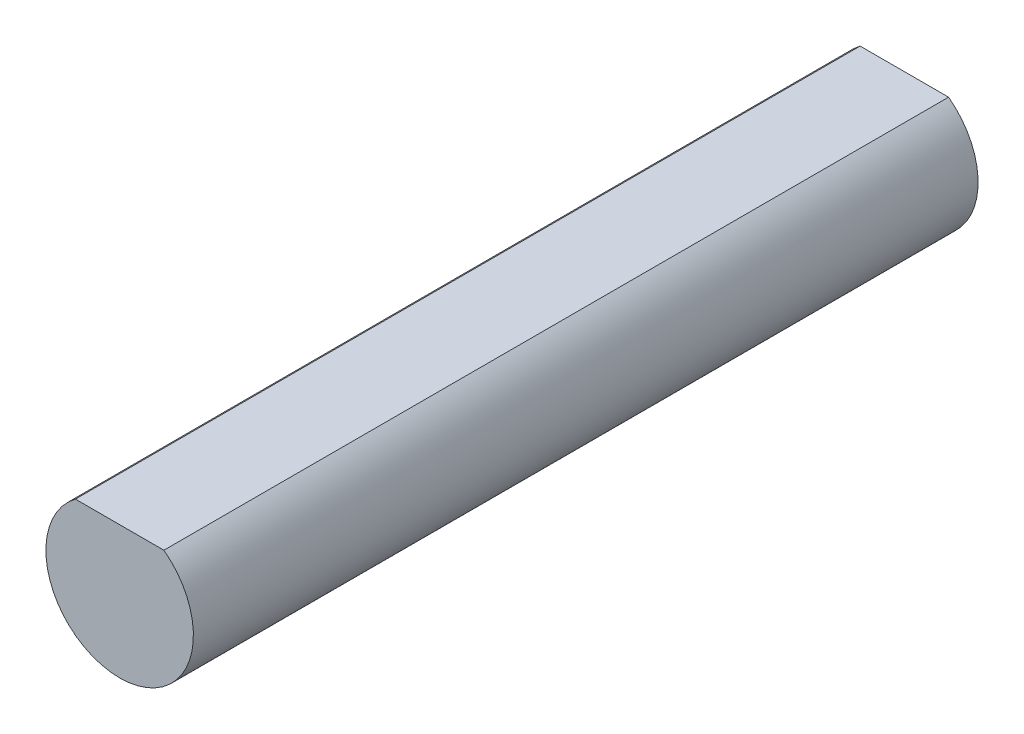
ISO-10303-21;
HEADER;
FILE_DESCRIPTION(('STEP AP214'),'2;1');
FILE_NAME('part.step','',(''),(''),'','','');
FILE_SCHEMA(('AUTOMOTIVE_DESIGN { 1 0 10303 214 1 1 1 1 }'));
ENDSEC;
DATA;
#1=APPLICATION_CONTEXT('core data for automotive mechanical design processes');
#2=APPLICATION_PROTOCOL_DEFINITION('international standard','automotive_design',2000,#1);
#3=PRODUCT_CONTEXT('',#1,'mechanical');
#4=PRODUCT('Part','Part','',(#3));
#5=PRODUCT_RELATED_PRODUCT_CATEGORY('part','',(#4));
#6=PRODUCT_DEFINITION_FORMATION('','',#4);
#7=PRODUCT_DEFINITION_CONTEXT('part definition',#1,'design');
#8=PRODUCT_DEFINITION('design','',#6,#7);
#9=PRODUCT_DEFINITION_SHAPE('','',#8);
#10=(LENGTH_UNIT() NAMED_UNIT(*) SI_UNIT(.MILLI.,.METRE.));
#11=(NAMED_UNIT(*) PLANE_ANGLE_UNIT() SI_UNIT($,.RADIAN.));
#12=(NAMED_UNIT(*) SI_UNIT($,.STERADIAN.) SOLID_ANGLE_UNIT());
#13=UNCERTAINTY_MEASURE_WITH_UNIT(LENGTH_MEASURE(1.E-05),#10,'distance_accuracy_value','');
#14=(GEOMETRIC_REPRESENTATION_CONTEXT(3) GLOBAL_UNCERTAINTY_ASSIGNED_CONTEXT((#13)) GLOBAL_UNIT_ASSIGNED_CONTEXT((#10,
#11,#12)) REPRESENTATION_CONTEXT('',''));
#15=CARTESIAN_POINT('',(0.,0.,0.));
#16=DIRECTION('',(0.,0.,1.));
#17=DIRECTION('',(1.,0.,0.));
#18=AXIS2_PLACEMENT_3D('',#15,#16,#17);
#19=CARTESIAN_POINT('',(0.,-0.25000000372529,24.));
#20=DIRECTION('',(0.,0.,1.));
#21=DIRECTION('',(1.,0.,0.));
#22=AXIS2_PLACEMENT_3D('',#19,#20,#21);
#23=PLANE('',#22);
#24=CARTESIAN_POINT('',(0.,0.,24.));
#25=DIRECTION('',(0.,0.,1.));
#26=DIRECTION('',(1.,0.,0.));
#27=AXIS2_PLACEMENT_3D('',#24,#25,#26);
#28=CIRCLE('',#27,2.5000000372529);
#29=CARTESIAN_POINT('',(1.50000002235174,2.00000002980232,24.));
#30=VERTEX_POINT('',#29);
#31=CARTESIAN_POINT('',(-1.50000002235174,2.00000002980232,24.));
#32=VERTEX_POINT('',#31);
#33=EDGE_CURVE('E20',#30,#32,#28,.F.);
#34=ORIENTED_EDGE('',*,*,#33,.F.);
#35=DIRECTION('',(1.,0.,0.));
#36=VECTOR('',#35,1.);
#37=CARTESIAN_POINT('',(1.50000002235174,2.00000002980232,24.));
#38=LINE('',#37,#36);
#39=EDGE_CURVE('E40',#32,#30,#38,.T.);
#40=ORIENTED_EDGE('',*,*,#39,.F.);
#41=EDGE_LOOP('',(#34,#40));
#42=FACE_BOUND('',#41,.T.);
#43=ADVANCED_FACE('F17',(#42),#23,.T.);
#44=CARTESIAN_POINT('',(1.50000002235174,2.00000002980232,0.));
#45=DIRECTION('',(0.,1.,0.));
#46=DIRECTION('',(0.,0.,1.));
#47=AXIS2_PLACEMENT_3D('',#44,#45,#46);
#48=PLANE('',#47);
#49=DIRECTION('',(0.,0.,1.));
#50=VECTOR('',#49,1.);
#51=CARTESIAN_POINT('',(1.50000002235174,2.00000002980232,0.));
#52=LINE('',#51,#50);
#53=CARTESIAN_POINT('',(1.50000002235174,2.00000002980232,-2.6));
#54=VERTEX_POINT('',#53);
#55=EDGE_CURVE('E44',#54,#30,#52,.T.);
#56=ORIENTED_EDGE('',*,*,#55,.F.);
#57=DIRECTION('',(1.,0.,0.));
#58=VECTOR('',#57,1.);
#59=CARTESIAN_POINT('',(0.,2.00000002980232,-2.6));
#60=LINE('',#59,#58);
#61=CARTESIAN_POINT('',(-1.50000002235174,2.00000002980232,-2.6));
#62=VERTEX_POINT('',#61);
#63=EDGE_CURVE('E33',#54,#62,#60,.F.);
#64=ORIENTED_EDGE('',*,*,#63,.T.);
#65=DIRECTION('',(0.,0.,1.));
#66=VECTOR('',#65,1.);
#67=CARTESIAN_POINT('',(-1.50000002235174,2.00000002980232,0.));
#68=LINE('',#67,#66);
#69=EDGE_CURVE('E26',#32,#62,#68,.F.);
#70=ORIENTED_EDGE('',*,*,#69,.F.);
#71=ORIENTED_EDGE('',*,*,#39,.T.);
#72=EDGE_LOOP('',(#56,#64,#70,#71));
#73=FACE_BOUND('',#72,.T.);
#74=ADVANCED_FACE('F42',(#73),#48,.T.);
#75=CARTESIAN_POINT('',(0.,-0.25000000372529,-2.6));
#76=DIRECTION('',(0.,0.,1.));
#77=DIRECTION('',(1.,0.,0.));
#78=AXIS2_PLACEMENT_3D('',#75,#76,#77);
#79=PLANE('',#78);
#80=ORIENTED_EDGE('',*,*,#63,.F.);
#81=CARTESIAN_POINT('',(0.,0.,-2.6));
#82=DIRECTION('',(0.,0.,1.));
#83=DIRECTION('',(1.,0.,0.));
#84=AXIS2_PLACEMENT_3D('',#81,#82,#83);
#85=CIRCLE('',#84,2.5000000372529);
#86=EDGE_CURVE('E11',#62,#54,#85,.T.);
#87=ORIENTED_EDGE('',*,*,#86,.F.);
#88=EDGE_LOOP('',(#80,#87));
#89=FACE_BOUND('',#88,.T.);
#90=ADVANCED_FACE('F55',(#89),#79,.F.);
#91=CARTESIAN_POINT('',(0.,0.,0.));
#92=DIRECTION('',(0.,0.,1.));
#93=DIRECTION('',(1.,0.,0.));
#94=AXIS2_PLACEMENT_3D('',#91,#92,#93);
#95=CYLINDRICAL_SURFACE('',#94,2.5000000372529);
#96=ORIENTED_EDGE('',*,*,#69,.T.);
#97=ORIENTED_EDGE('',*,*,#86,.T.);
#98=ORIENTED_EDGE('',*,*,#55,.T.);
#99=ORIENTED_EDGE('',*,*,#33,.T.);
#100=EDGE_LOOP('',(#96,#97,#98,#99));
#101=FACE_BOUND('',#100,.T.);
#102=ADVANCED_FACE('F50',(#101),#95,.T.);
#103=CLOSED_SHELL('',(#43,#74,#90,#102));
#104=MANIFOLD_SOLID_BREP('B1',#103);
#105=ADVANCED_BREP_SHAPE_REPRESENTATION('',(#18,#104),#14);
#106=SHAPE_DEFINITION_REPRESENTATION(#9,#105);
ENDSEC;
END-ISO-10303-21;
